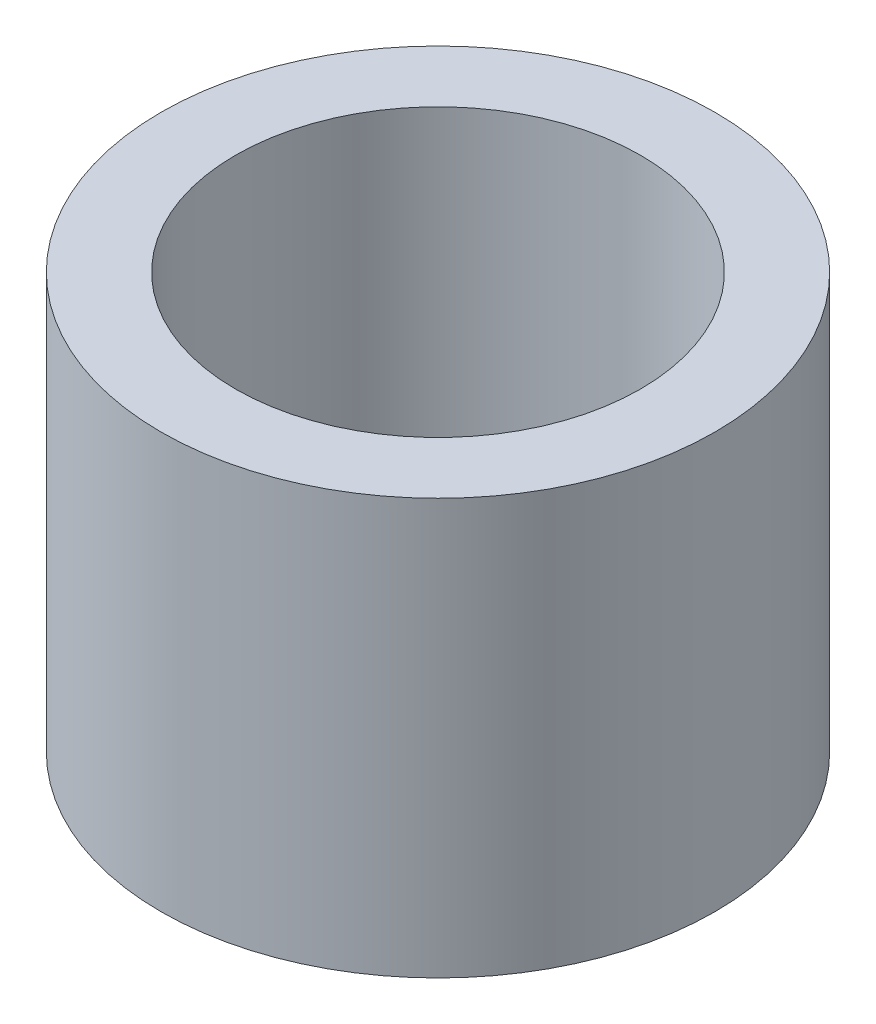
ISO-10303-21;
HEADER;
FILE_DESCRIPTION(('STEP AP214'),'2;1');
FILE_NAME('part.step','',(''),(''),'','','');
FILE_SCHEMA(('AUTOMOTIVE_DESIGN { 1 0 10303 214 1 1 1 1 }'));
ENDSEC;
DATA;
#1=APPLICATION_CONTEXT('core data for automotive mechanical design processes');
#2=APPLICATION_PROTOCOL_DEFINITION('international standard','automotive_design',2000,#1);
#3=PRODUCT_CONTEXT('',#1,'mechanical');
#4=PRODUCT('Part','Part','',(#3));
#5=PRODUCT_RELATED_PRODUCT_CATEGORY('part','',(#4));
#6=PRODUCT_DEFINITION_FORMATION('','',#4);
#7=PRODUCT_DEFINITION_CONTEXT('part definition',#1,'design');
#8=PRODUCT_DEFINITION('design','',#6,#7);
#9=PRODUCT_DEFINITION_SHAPE('','',#8);
#10=(LENGTH_UNIT() NAMED_UNIT(*) SI_UNIT(.MILLI.,.METRE.));
#11=(NAMED_UNIT(*) PLANE_ANGLE_UNIT() SI_UNIT($,.RADIAN.));
#12=(NAMED_UNIT(*) SI_UNIT($,.STERADIAN.) SOLID_ANGLE_UNIT());
#13=UNCERTAINTY_MEASURE_WITH_UNIT(LENGTH_MEASURE(1.E-05),#10,'distance_accuracy_value','');
#14=(GEOMETRIC_REPRESENTATION_CONTEXT(3) GLOBAL_UNCERTAINTY_ASSIGNED_CONTEXT((#13)) GLOBAL_UNIT_ASSIGNED_CONTEXT((#10,
#11,#12)) REPRESENTATION_CONTEXT('',''));
#15=CARTESIAN_POINT('',(0.,0.,0.));
#16=DIRECTION('',(0.,0.,1.));
#17=DIRECTION('',(1.,0.,0.));
#18=AXIS2_PLACEMENT_3D('',#15,#16,#17);
#19=CARTESIAN_POINT('',(0.,6.,0.));
#20=DIRECTION('',(0.,-1.,0.));
#21=DIRECTION('',(0.,0.,-1.));
#22=AXIS2_PLACEMENT_3D('',#19,#20,#21);
#23=CYLINDRICAL_SURFACE('',#22,4.);
#24=CARTESIAN_POINT('',(0.,6.,0.));
#25=DIRECTION('',(0.,1.,0.));
#26=DIRECTION('',(0.,0.,1.));
#27=AXIS2_PLACEMENT_3D('',#24,#25,#26);
#28=CIRCLE('',#27,4.);
#29=CARTESIAN_POINT('',(0.,6.,4.));
#30=VERTEX_POINT('',#29);
#31=EDGE_CURVE('E10',#30,#30,#28,.T.);
#32=ORIENTED_EDGE('',*,*,#31,.F.);
#33=EDGE_LOOP('',(#32));
#34=FACE_BOUND('',#33,.T.);
#35=CARTESIAN_POINT('',(0.,0.,0.));
#36=DIRECTION('',(0.,1.,0.));
#37=DIRECTION('',(0.,0.,1.));
#38=AXIS2_PLACEMENT_3D('',#35,#36,#37);
#39=CIRCLE('',#38,4.);
#40=CARTESIAN_POINT('',(0.,0.,4.));
#41=VERTEX_POINT('',#40);
#42=EDGE_CURVE('E42',#41,#41,#39,.T.);
#43=ORIENTED_EDGE('',*,*,#42,.T.);
#44=EDGE_LOOP('',(#43));
#45=FACE_BOUND('',#44,.T.);
#46=ADVANCED_FACE('F35',(#34,#45),#23,.T.);
#47=CARTESIAN_POINT('',(0.,6.,0.));
#48=DIRECTION('',(0.,1.,0.));
#49=DIRECTION('',(0.,0.,1.));
#50=AXIS2_PLACEMENT_3D('',#47,#48,#49);
#51=PLANE('',#50);
#52=CARTESIAN_POINT('',(0.,6.,0.));
#53=DIRECTION('',(0.,1.,0.));
#54=DIRECTION('',(0.,0.,1.));
#55=AXIS2_PLACEMENT_3D('',#52,#53,#54);
#56=CIRCLE('',#55,2.925);
#57=CARTESIAN_POINT('',(0.,6.,2.925));
#58=VERTEX_POINT('',#57);
#59=EDGE_CURVE('E48',#58,#58,#56,.T.);
#60=ORIENTED_EDGE('',*,*,#59,.F.);
#61=EDGE_LOOP('',(#60));
#62=FACE_BOUND('',#61,.T.);
#63=ORIENTED_EDGE('',*,*,#31,.T.);
#64=EDGE_LOOP('',(#63));
#65=FACE_BOUND('',#64,.T.);
#66=ADVANCED_FACE('F64',(#62,#65),#51,.T.);
#67=CARTESIAN_POINT('',(0.,0.,0.));
#68=DIRECTION('',(0.,1.,0.));
#69=DIRECTION('',(0.,0.,1.));
#70=AXIS2_PLACEMENT_3D('',#67,#68,#69);
#71=PLANE('',#70);
#72=CARTESIAN_POINT('',(0.,0.,0.));
#73=DIRECTION('',(0.,1.,0.));
#74=DIRECTION('',(0.,0.,1.));
#75=AXIS2_PLACEMENT_3D('',#72,#73,#74);
#76=CIRCLE('',#75,2.925);
#77=CARTESIAN_POINT('',(0.,0.,2.925));
#78=VERTEX_POINT('',#77);
#79=EDGE_CURVE('E38',#78,#78,#76,.T.);
#80=ORIENTED_EDGE('',*,*,#79,.T.);
#81=EDGE_LOOP('',(#80));
#82=FACE_BOUND('',#81,.T.);
#83=ORIENTED_EDGE('',*,*,#42,.F.);
#84=EDGE_LOOP('',(#83));
#85=FACE_BOUND('',#84,.T.);
#86=ADVANCED_FACE('F55',(#82,#85),#71,.F.);
#87=CARTESIAN_POINT('',(0.,-4.,0.));
#88=DIRECTION('',(0.,1.,0.));
#89=DIRECTION('',(0.,0.,1.));
#90=AXIS2_PLACEMENT_3D('',#87,#88,#89);
#91=CYLINDRICAL_SURFACE('',#90,2.925);
#92=ORIENTED_EDGE('',*,*,#59,.T.);
#93=EDGE_LOOP('',(#92));
#94=FACE_BOUND('',#93,.T.);
#95=ORIENTED_EDGE('',*,*,#79,.F.);
#96=EDGE_LOOP('',(#95));
#97=FACE_BOUND('',#96,.T.);
#98=ADVANCED_FACE('F58',(#94,#97),#91,.F.);
#99=CLOSED_SHELL('',(#46,#66,#86,#98));
#100=MANIFOLD_SOLID_BREP('B2',#99);
#101=ADVANCED_BREP_SHAPE_REPRESENTATION('',(#18,#100),#14);
#102=SHAPE_DEFINITION_REPRESENTATION(#9,#101);
ENDSEC;
END-ISO-10303-21;
